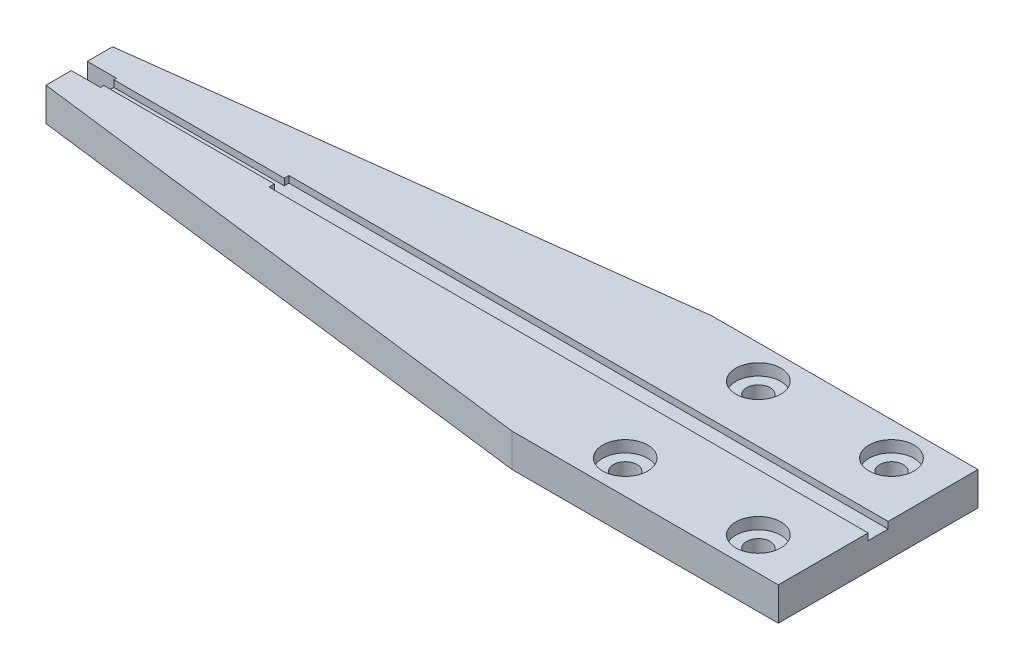
ISO-10303-21;
HEADER;
FILE_DESCRIPTION(('STEP AP214'),'2;1');
FILE_NAME('part.step','',(''),(''),'','','');
FILE_SCHEMA(('AUTOMOTIVE_DESIGN { 1 0 10303 214 1 1 1 1 }'));
ENDSEC;
DATA;
#1=APPLICATION_CONTEXT('core data for automotive mechanical design processes');
#2=APPLICATION_PROTOCOL_DEFINITION('international standard','automotive_design',2000,#1);
#3=PRODUCT_CONTEXT('',#1,'mechanical');
#4=PRODUCT('Part','Part','',(#3));
#5=PRODUCT_RELATED_PRODUCT_CATEGORY('part','',(#4));
#6=PRODUCT_DEFINITION_FORMATION('','',#4);
#7=PRODUCT_DEFINITION_CONTEXT('part definition',#1,'design');
#8=PRODUCT_DEFINITION('design','',#6,#7);
#9=PRODUCT_DEFINITION_SHAPE('','',#8);
#10=(LENGTH_UNIT() NAMED_UNIT(*) SI_UNIT(.MILLI.,.METRE.));
#11=(NAMED_UNIT(*) PLANE_ANGLE_UNIT() SI_UNIT($,.RADIAN.));
#12=(NAMED_UNIT(*) SI_UNIT($,.STERADIAN.) SOLID_ANGLE_UNIT());
#13=UNCERTAINTY_MEASURE_WITH_UNIT(LENGTH_MEASURE(1.E-05),#10,'distance_accuracy_value','');
#14=(GEOMETRIC_REPRESENTATION_CONTEXT(3) GLOBAL_UNCERTAINTY_ASSIGNED_CONTEXT((#13)) GLOBAL_UNIT_ASSIGNED_CONTEXT((#10,
#11,#12)) REPRESENTATION_CONTEXT('',''));
#15=CARTESIAN_POINT('',(0.,0.,0.));
#16=DIRECTION('',(0.,0.,1.));
#17=DIRECTION('',(1.,0.,0.));
#18=AXIS2_PLACEMENT_3D('',#15,#16,#17);
#19=CARTESIAN_POINT('',(152.4,3.175,19.05));
#20=DIRECTION('',(0.,-1.,0.));
#21=DIRECTION('',(0.,0.,-1.));
#22=AXIS2_PLACEMENT_3D('',#19,#20,#21);
#23=PLANE('',#22);
#24=CARTESIAN_POINT('',(116.847626006516,3.175,-12.7));
#25=DIRECTION('',(0.,1.,0.));
#26=DIRECTION('',(0.,0.,1.));
#27=AXIS2_PLACEMENT_3D('',#24,#25,#26);
#28=CIRCLE('',#27,4.3);
#29=CARTESIAN_POINT('',(116.847626006516,3.175,-8.4));
#30=VERTEX_POINT('',#29);
#31=EDGE_CURVE('E338',#30,#30,#28,.T.);
#32=ORIENTED_EDGE('',*,*,#31,.F.);
#33=EDGE_LOOP('',(#32));
#34=FACE_BOUND('',#33,.T.);
#35=CARTESIAN_POINT('',(142.247626006516,3.175,-12.7));
#36=DIRECTION('',(0.,1.,0.));
#37=DIRECTION('',(0.,0.,1.));
#38=AXIS2_PLACEMENT_3D('',#35,#36,#37);
#39=CIRCLE('',#38,4.3);
#40=CARTESIAN_POINT('',(142.247626006516,3.175,-8.4));
#41=VERTEX_POINT('',#40);
#42=EDGE_CURVE('E322',#41,#41,#39,.T.);
#43=ORIENTED_EDGE('',*,*,#42,.F.);
#44=EDGE_LOOP('',(#43));
#45=FACE_BOUND('',#44,.T.);
#46=DIRECTION('',(-1.,0.,0.));
#47=VECTOR('',#46,1.);
#48=CARTESIAN_POINT('',(152.4,3.175,-19.05));
#49=LINE('',#48,#47);
#50=CARTESIAN_POINT('',(152.4,3.175,-19.05));
#51=VERTEX_POINT('',#50);
#52=CARTESIAN_POINT('',(101.6,3.175,-19.05));
#53=VERTEX_POINT('',#52);
#54=EDGE_CURVE('E218',#51,#53,#49,.T.);
#55=ORIENTED_EDGE('',*,*,#54,.T.);
#56=DIRECTION('',(0.992277876713668,0.,-0.124034734589209));
#57=VECTOR('',#56,1.);
#58=CARTESIAN_POINT('',(0.,3.175,-6.35));
#59=LINE('',#58,#57);
#60=CARTESIAN_POINT('',(0.,3.175,-6.35));
#61=VERTEX_POINT('',#60);
#62=EDGE_CURVE('E421',#61,#53,#59,.T.);
#63=ORIENTED_EDGE('',*,*,#62,.F.);
#64=DIRECTION('',(0.,0.,1.));
#65=VECTOR('',#64,1.);
#66=CARTESIAN_POINT('',(0.,3.175,19.05));
#67=LINE('',#66,#65);
#68=CARTESIAN_POINT('',(0.,3.175,-1.52399999999999));
#69=VERTEX_POINT('',#68);
#70=EDGE_CURVE('E199',#61,#69,#67,.T.);
#71=ORIENTED_EDGE('',*,*,#70,.T.);
#72=DIRECTION('',(-1.,0.,0.));
#73=VECTOR('',#72,1.);
#74=CARTESIAN_POINT('',(5.588,3.175,-1.524));
#75=LINE('',#74,#73);
#76=CARTESIAN_POINT('',(5.588,3.175,-1.524));
#77=VERTEX_POINT('',#76);
#78=EDGE_CURVE('E282',#77,#69,#75,.T.);
#79=ORIENTED_EDGE('',*,*,#78,.F.);
#80=DIRECTION('',(0.,0.,-1.));
#81=VECTOR('',#80,1.);
#82=CARTESIAN_POINT('',(5.588,3.175,1.524));
#83=LINE('',#82,#81);
#84=CARTESIAN_POINT('',(5.588,3.175,-1.016));
#85=VERTEX_POINT('',#84);
#86=EDGE_CURVE('E270',#85,#77,#83,.T.);
#87=ORIENTED_EDGE('',*,*,#86,.F.);
#88=DIRECTION('',(-1.,0.,0.));
#89=VECTOR('',#88,1.);
#90=CARTESIAN_POINT('',(5.588,3.175,-1.016));
#91=LINE('',#90,#89);
#92=CARTESIAN_POINT('',(38.1,3.175,-1.016));
#93=VERTEX_POINT('',#92);
#94=EDGE_CURVE('E441',#93,#85,#91,.T.);
#95=ORIENTED_EDGE('',*,*,#94,.F.);
#96=DIRECTION('',(0.,0.,1.));
#97=VECTOR('',#96,1.);
#98=CARTESIAN_POINT('',(38.1,3.175,1.90500000000054));
#99=LINE('',#98,#97);
#100=CARTESIAN_POINT('',(38.1,3.175,-1.90499999999946));
#101=VERTEX_POINT('',#100);
#102=EDGE_CURVE('E238',#101,#93,#99,.T.);
#103=ORIENTED_EDGE('',*,*,#102,.F.);
#104=DIRECTION('',(-1.,0.,0.));
#105=VECTOR('',#104,1.);
#106=CARTESIAN_POINT('',(38.1,3.175,-1.90499999999946));
#107=LINE('',#106,#105);
#108=CARTESIAN_POINT('',(152.4,3.175,-1.905));
#109=VERTEX_POINT('',#108);
#110=EDGE_CURVE('E235',#109,#101,#107,.T.);
#111=ORIENTED_EDGE('',*,*,#110,.F.);
#112=DIRECTION('',(0.,0.,1.));
#113=VECTOR('',#112,1.);
#114=CARTESIAN_POINT('',(152.4,3.175,19.05));
#115=LINE('',#114,#113);
#116=EDGE_CURVE('E210',#51,#109,#115,.T.);
#117=ORIENTED_EDGE('',*,*,#116,.F.);
#118=EDGE_LOOP('',(#55,#63,#71,#79,#87,#95,#103,#111,#117));
#119=FACE_BOUND('',#118,.T.);
#120=ADVANCED_FACE('F42',(#34,#45,#119),#23,.F.);
#121=CARTESIAN_POINT('',(38.1,1.905,1.90500000000054));
#122=DIRECTION('',(-1.,0.,0.));
#123=DIRECTION('',(0.,0.,1.));
#124=AXIS2_PLACEMENT_3D('',#121,#122,#123);
#125=PLANE('',#124);
#126=ORIENTED_EDGE('',*,*,#102,.T.);
#127=DIRECTION('',(0.,1.,0.));
#128=VECTOR('',#127,1.);
#129=CARTESIAN_POINT('',(38.1,1.905,-1.016));
#130=LINE('',#129,#128);
#131=CARTESIAN_POINT('',(38.1,1.905,-1.016));
#132=VERTEX_POINT('',#131);
#133=EDGE_CURVE('E458',#132,#93,#130,.T.);
#134=ORIENTED_EDGE('',*,*,#133,.F.);
#135=DIRECTION('',(0.,0.,1.));
#136=VECTOR('',#135,1.);
#137=CARTESIAN_POINT('',(38.1,1.905,1.90500000000054));
#138=LINE('',#137,#136);
#139=CARTESIAN_POINT('',(38.1,1.905,-1.90499999999946));
#140=VERTEX_POINT('',#139);
#141=EDGE_CURVE('E246',#140,#132,#138,.T.);
#142=ORIENTED_EDGE('',*,*,#141,.F.);
#143=DIRECTION('',(0.,1.,0.));
#144=VECTOR('',#143,1.);
#145=CARTESIAN_POINT('',(38.1,1.905,-1.90499999999946));
#146=LINE('',#145,#144);
#147=EDGE_CURVE('E251',#140,#101,#146,.T.);
#148=ORIENTED_EDGE('',*,*,#147,.T.);
#149=EDGE_LOOP('',(#126,#134,#142,#148));
#150=FACE_BOUND('',#149,.T.);
#151=ADVANCED_FACE('F388',(#150),#125,.F.);
#152=CARTESIAN_POINT('',(152.4,3.175,19.05));
#153=DIRECTION('',(0.,0.,-1.));
#154=DIRECTION('',(-1.,0.,0.));
#155=AXIS2_PLACEMENT_3D('',#152,#153,#154);
#156=PLANE('',#155);
#157=DIRECTION('',(-1.,0.,0.));
#158=VECTOR('',#157,1.);
#159=CARTESIAN_POINT('',(152.4,3.175,19.05));
#160=LINE('',#159,#158);
#161=CARTESIAN_POINT('',(152.4,3.175,19.05));
#162=VERTEX_POINT('',#161);
#163=CARTESIAN_POINT('',(101.6,3.175,19.05));
#164=VERTEX_POINT('',#163);
#165=EDGE_CURVE('E179',#162,#164,#160,.T.);
#166=ORIENTED_EDGE('',*,*,#165,.T.);
#167=DIRECTION('',(0.,1.,0.));
#168=VECTOR('',#167,1.);
#169=CARTESIAN_POINT('',(101.6,-3.175,19.05));
#170=LINE('',#169,#168);
#171=CARTESIAN_POINT('',(101.6,-3.175,19.05));
#172=VERTEX_POINT('',#171);
#173=EDGE_CURVE('E170',#172,#164,#170,.T.);
#174=ORIENTED_EDGE('',*,*,#173,.F.);
#175=DIRECTION('',(-1.,0.,0.));
#176=VECTOR('',#175,1.);
#177=CARTESIAN_POINT('',(152.4,-3.175,19.05));
#178=LINE('',#177,#176);
#179=CARTESIAN_POINT('',(152.4,-3.175,19.05));
#180=VERTEX_POINT('',#179);
#181=EDGE_CURVE('E11',#180,#172,#178,.T.);
#182=ORIENTED_EDGE('',*,*,#181,.F.);
#183=DIRECTION('',(0.,-1.,0.));
#184=VECTOR('',#183,1.);
#185=CARTESIAN_POINT('',(152.4,3.175,19.05));
#186=LINE('',#185,#184);
#187=EDGE_CURVE('E191',#162,#180,#186,.T.);
#188=ORIENTED_EDGE('',*,*,#187,.F.);
#189=EDGE_LOOP('',(#166,#174,#182,#188));
#190=FACE_BOUND('',#189,.T.);
#191=ADVANCED_FACE('F44',(#190),#156,.F.);
#192=CARTESIAN_POINT('',(152.4,-3.175,19.05));
#193=DIRECTION('',(0.,1.,0.));
#194=DIRECTION('',(0.,0.,1.));
#195=AXIS2_PLACEMENT_3D('',#192,#193,#194);
#196=PLANE('',#195);
#197=CARTESIAN_POINT('',(142.247626006516,-3.175,12.7));
#198=DIRECTION('',(0.,1.,0.));
#199=DIRECTION('',(0.,0.,1.));
#200=AXIS2_PLACEMENT_3D('',#197,#198,#199);
#201=CIRCLE('',#200,2.25);
#202=CARTESIAN_POINT('',(142.247626006516,-3.175,14.95));
#203=VERTEX_POINT('',#202);
#204=EDGE_CURVE('E318',#203,#203,#201,.T.);
#205=ORIENTED_EDGE('',*,*,#204,.T.);
#206=EDGE_LOOP('',(#205));
#207=FACE_BOUND('',#206,.T.);
#208=CARTESIAN_POINT('',(142.247626006516,-3.175,-12.7));
#209=DIRECTION('',(0.,1.,0.));
#210=DIRECTION('',(0.,0.,1.));
#211=AXIS2_PLACEMENT_3D('',#208,#209,#210);
#212=CIRCLE('',#211,2.25);
#213=CARTESIAN_POINT('',(142.247626006516,-3.175,-10.45));
#214=VERTEX_POINT('',#213);
#215=EDGE_CURVE('E334',#214,#214,#212,.T.);
#216=ORIENTED_EDGE('',*,*,#215,.T.);
#217=EDGE_LOOP('',(#216));
#218=FACE_BOUND('',#217,.T.);
#219=CARTESIAN_POINT('',(116.847626006516,-3.175,-12.7));
#220=DIRECTION('',(0.,1.,0.));
#221=DIRECTION('',(0.,0.,1.));
#222=AXIS2_PLACEMENT_3D('',#219,#220,#221);
#223=CIRCLE('',#222,2.25);
#224=CARTESIAN_POINT('',(116.847626006516,-3.175,-10.45));
#225=VERTEX_POINT('',#224);
#226=EDGE_CURVE('E350',#225,#225,#223,.T.);
#227=ORIENTED_EDGE('',*,*,#226,.T.);
#228=EDGE_LOOP('',(#227));
#229=FACE_BOUND('',#228,.T.);
#230=CARTESIAN_POINT('',(116.847626006516,-3.175,12.7));
#231=DIRECTION('',(0.,1.,0.));
#232=DIRECTION('',(0.,0.,1.));
#233=AXIS2_PLACEMENT_3D('',#230,#231,#232);
#234=CIRCLE('',#233,2.25);
#235=CARTESIAN_POINT('',(116.847626006516,-3.175,14.95));
#236=VERTEX_POINT('',#235);
#237=EDGE_CURVE('E205',#236,#236,#234,.T.);
#238=ORIENTED_EDGE('',*,*,#237,.T.);
#239=EDGE_LOOP('',(#238));
#240=FACE_BOUND('',#239,.T.);
#241=ORIENTED_EDGE('',*,*,#181,.T.);
#242=DIRECTION('',(-0.992277876713668,0.,-0.124034734589208));
#243=VECTOR('',#242,1.);
#244=CARTESIAN_POINT('',(0.,-3.175,6.35));
#245=LINE('',#244,#243);
#246=CARTESIAN_POINT('',(0.,-3.175,6.35));
#247=VERTEX_POINT('',#246);
#248=EDGE_CURVE('E167',#172,#247,#245,.T.);
#249=ORIENTED_EDGE('',*,*,#248,.T.);
#250=DIRECTION('',(0.,0.,-1.));
#251=VECTOR('',#250,1.);
#252=CARTESIAN_POINT('',(0.,-3.175,19.05));
#253=LINE('',#252,#251);
#254=CARTESIAN_POINT('',(0.,-3.175,-6.34999999999999));
#255=VERTEX_POINT('',#254);
#256=EDGE_CURVE('E66',#247,#255,#253,.T.);
#257=ORIENTED_EDGE('',*,*,#256,.T.);
#258=DIRECTION('',(0.992277876713668,0.,-0.124034734589209));
#259=VECTOR('',#258,1.);
#260=CARTESIAN_POINT('',(0.,-3.175,-6.35));
#261=LINE('',#260,#259);
#262=CARTESIAN_POINT('',(101.6,-3.175,-19.05));
#263=VERTEX_POINT('',#262);
#264=EDGE_CURVE('E424',#255,#263,#261,.T.);
#265=ORIENTED_EDGE('',*,*,#264,.T.);
#266=DIRECTION('',(-1.,0.,0.));
#267=VECTOR('',#266,1.);
#268=CARTESIAN_POINT('',(152.4,-3.175,-19.05));
#269=LINE('',#268,#267);
#270=CARTESIAN_POINT('',(152.4,-3.175,-19.05));
#271=VERTEX_POINT('',#270);
#272=EDGE_CURVE('E51',#271,#263,#269,.T.);
#273=ORIENTED_EDGE('',*,*,#272,.F.);
#274=DIRECTION('',(0.,0.,-1.));
#275=VECTOR('',#274,1.);
#276=CARTESIAN_POINT('',(152.4,-3.175,19.05));
#277=LINE('',#276,#275);
#278=EDGE_CURVE('E184',#180,#271,#277,.T.);
#279=ORIENTED_EDGE('',*,*,#278,.F.);
#280=EDGE_LOOP('',(#241,#249,#257,#265,#273,#279));
#281=FACE_BOUND('',#280,.T.);
#282=ADVANCED_FACE('F182',(#207,#218,#229,#240,#281),#196,.F.);
#283=CARTESIAN_POINT('',(152.4,3.175,-19.05));
#284=DIRECTION('',(0.,0.,1.));
#285=DIRECTION('',(1.,0.,0.));
#286=AXIS2_PLACEMENT_3D('',#283,#284,#285);
#287=PLANE('',#286);
#288=ORIENTED_EDGE('',*,*,#272,.T.);
#289=DIRECTION('',(0.,1.,0.));
#290=VECTOR('',#289,1.);
#291=CARTESIAN_POINT('',(101.6,-3.175,-19.05));
#292=LINE('',#291,#290);
#293=EDGE_CURVE('E226',#263,#53,#292,.T.);
#294=ORIENTED_EDGE('',*,*,#293,.T.);
#295=ORIENTED_EDGE('',*,*,#54,.F.);
#296=DIRECTION('',(0.,1.,0.));
#297=VECTOR('',#296,1.);
#298=CARTESIAN_POINT('',(152.4,3.175,-19.05));
#299=LINE('',#298,#297);
#300=EDGE_CURVE('E190',#271,#51,#299,.T.);
#301=ORIENTED_EDGE('',*,*,#300,.F.);
#302=EDGE_LOOP('',(#288,#294,#295,#301));
#303=FACE_BOUND('',#302,.T.);
#304=ADVANCED_FACE('F224',(#303),#287,.F.);
#305=CARTESIAN_POINT('',(142.247626006516,3.175,12.7));
#306=DIRECTION('',(0.,1.,0.));
#307=DIRECTION('',(0.,0.,1.));
#308=AXIS2_PLACEMENT_3D('',#305,#306,#307);
#309=CIRCLE('',#308,4.3);
#310=CARTESIAN_POINT('',(142.247626006516,3.175,17.));
#311=VERTEX_POINT('',#310);
#312=EDGE_CURVE('E297',#311,#311,#309,.T.);
#313=ORIENTED_EDGE('',*,*,#312,.F.);
#314=EDGE_LOOP('',(#313));
#315=FACE_BOUND('',#314,.T.);
#316=CARTESIAN_POINT('',(116.847626006516,3.175,12.7));
#317=DIRECTION('',(0.,1.,0.));
#318=DIRECTION('',(0.,0.,1.));
#319=AXIS2_PLACEMENT_3D('',#316,#317,#318);
#320=CIRCLE('',#319,4.3);
#321=CARTESIAN_POINT('',(116.847626006516,3.175,17.));
#322=VERTEX_POINT('',#321);
#323=EDGE_CURVE('E354',#322,#322,#320,.T.);
#324=ORIENTED_EDGE('',*,*,#323,.F.);
#325=EDGE_LOOP('',(#324));
#326=FACE_BOUND('',#325,.T.);
#327=CARTESIAN_POINT('',(0.,3.175,1.524));
#328=VERTEX_POINT('',#327);
#329=CARTESIAN_POINT('',(0.,3.175,6.35));
#330=VERTEX_POINT('',#329);
#331=EDGE_CURVE('E202',#328,#330,#67,.T.);
#332=ORIENTED_EDGE('',*,*,#331,.T.);
#333=DIRECTION('',(-0.992277876713668,0.,-0.124034734589208));
#334=VECTOR('',#333,1.);
#335=CARTESIAN_POINT('',(0.,3.175,6.35));
#336=LINE('',#335,#334);
#337=EDGE_CURVE('E58',#164,#330,#336,.T.);
#338=ORIENTED_EDGE('',*,*,#337,.F.);
#339=ORIENTED_EDGE('',*,*,#165,.F.);
#340=CARTESIAN_POINT('',(152.4,3.175,1.905));
#341=VERTEX_POINT('',#340);
#342=EDGE_CURVE('E197',#341,#162,#115,.T.);
#343=ORIENTED_EDGE('',*,*,#342,.F.);
#344=DIRECTION('',(1.,0.,0.));
#345=VECTOR('',#344,1.);
#346=CARTESIAN_POINT('',(152.4,3.175,1.905));
#347=LINE('',#346,#345);
#348=CARTESIAN_POINT('',(38.1,3.175,1.90500000000054));
#349=VERTEX_POINT('',#348);
#350=EDGE_CURVE('E242',#349,#341,#347,.T.);
#351=ORIENTED_EDGE('',*,*,#350,.F.);
#352=CARTESIAN_POINT('',(38.1,3.175,0.889));
#353=VERTEX_POINT('',#352);
#354=EDGE_CURVE('E457',#353,#349,#99,.T.);
#355=ORIENTED_EDGE('',*,*,#354,.F.);
#356=DIRECTION('',(1.,0.,0.));
#357=VECTOR('',#356,1.);
#358=CARTESIAN_POINT('',(38.1,3.175,0.889));
#359=LINE('',#358,#357);
#360=CARTESIAN_POINT('',(5.588,3.175,0.889000000000004));
#361=VERTEX_POINT('',#360);
#362=EDGE_CURVE('E433',#361,#353,#359,.T.);
#363=ORIENTED_EDGE('',*,*,#362,.F.);
#364=CARTESIAN_POINT('',(5.588,3.175,1.524));
#365=VERTEX_POINT('',#364);
#366=EDGE_CURVE('E265',#365,#361,#83,.T.);
#367=ORIENTED_EDGE('',*,*,#366,.F.);
#368=DIRECTION('',(-1.,0.,0.));
#369=VECTOR('',#368,1.);
#370=CARTESIAN_POINT('',(5.588,3.175,1.524));
#371=LINE('',#370,#369);
#372=EDGE_CURVE('E293',#365,#328,#371,.T.);
#373=ORIENTED_EDGE('',*,*,#372,.T.);
#374=EDGE_LOOP('',(#332,#338,#339,#343,#351,#355,#363,#367,#373));
#375=FACE_BOUND('',#374,.T.);
#376=ADVANCED_FACE('F391',(#315,#326,#375),#23,.F.);
#377=CARTESIAN_POINT('',(152.4,0.,0.));
#378=DIRECTION('',(1.,0.,0.));
#379=DIRECTION('',(0.,0.,-1.));
#380=AXIS2_PLACEMENT_3D('',#377,#378,#379);
#381=PLANE('',#380);
#382=DIRECTION('',(0.,1.,0.));
#383=VECTOR('',#382,1.);
#384=CARTESIAN_POINT('',(152.4,1.905,-1.905));
#385=LINE('',#384,#383);
#386=CARTESIAN_POINT('',(152.4,1.905,-1.905));
#387=VERTEX_POINT('',#386);
#388=EDGE_CURVE('E229',#387,#109,#385,.T.);
#389=ORIENTED_EDGE('',*,*,#388,.F.);
#390=DIRECTION('',(0.,0.,-1.));
#391=VECTOR('',#390,1.);
#392=CARTESIAN_POINT('',(152.4,1.905,-1.905));
#393=LINE('',#392,#391);
#394=CARTESIAN_POINT('',(152.4,1.905,1.90500000000054));
#395=VERTEX_POINT('',#394);
#396=EDGE_CURVE('E472',#395,#387,#393,.T.);
#397=ORIENTED_EDGE('',*,*,#396,.F.);
#398=DIRECTION('',(0.,1.,0.));
#399=VECTOR('',#398,1.);
#400=CARTESIAN_POINT('',(152.4,1.905,1.905));
#401=LINE('',#400,#399);
#402=EDGE_CURVE('E257',#395,#341,#401,.T.);
#403=ORIENTED_EDGE('',*,*,#402,.T.);
#404=ORIENTED_EDGE('',*,*,#342,.T.);
#405=ORIENTED_EDGE('',*,*,#187,.T.);
#406=ORIENTED_EDGE('',*,*,#278,.T.);
#407=ORIENTED_EDGE('',*,*,#300,.T.);
#408=ORIENTED_EDGE('',*,*,#116,.T.);
#409=EDGE_LOOP('',(#389,#397,#403,#404,#405,#406,#407,#408));
#410=FACE_BOUND('',#409,.T.);
#411=ADVANCED_FACE('F194',(#410),#381,.T.);
#412=CARTESIAN_POINT('',(0.,0.,0.));
#413=DIRECTION('',(1.,0.,0.));
#414=DIRECTION('',(0.,0.,-1.));
#415=AXIS2_PLACEMENT_3D('',#412,#413,#414);
#416=PLANE('',#415);
#417=ORIENTED_EDGE('',*,*,#256,.F.);
#418=DIRECTION('',(0.,1.,0.));
#419=VECTOR('',#418,1.);
#420=CARTESIAN_POINT('',(0.,-3.175,6.35));
#421=LINE('',#420,#419);
#422=EDGE_CURVE('E171',#247,#330,#421,.T.);
#423=ORIENTED_EDGE('',*,*,#422,.T.);
#424=ORIENTED_EDGE('',*,*,#331,.F.);
#425=DIRECTION('',(0.,1.,0.));
#426=VECTOR('',#425,1.);
#427=CARTESIAN_POINT('',(0.,0.127,1.524));
#428=LINE('',#427,#426);
#429=CARTESIAN_POINT('',(0.,0.127,1.524));
#430=VERTEX_POINT('',#429);
#431=EDGE_CURVE('E290',#430,#328,#428,.T.);
#432=ORIENTED_EDGE('',*,*,#431,.F.);
#433=DIRECTION('',(0.,0.,1.));
#434=VECTOR('',#433,1.);
#435=CARTESIAN_POINT('',(0.,0.127,-1.524));
#436=LINE('',#435,#434);
#437=CARTESIAN_POINT('',(0.,0.127,-1.524));
#438=VERTEX_POINT('',#437);
#439=EDGE_CURVE('E286',#438,#430,#436,.T.);
#440=ORIENTED_EDGE('',*,*,#439,.F.);
#441=DIRECTION('',(0.,-1.,0.));
#442=VECTOR('',#441,1.);
#443=CARTESIAN_POINT('',(0.,3.175,-1.524));
#444=LINE('',#443,#442);
#445=EDGE_CURVE('E254',#69,#438,#444,.T.);
#446=ORIENTED_EDGE('',*,*,#445,.F.);
#447=ORIENTED_EDGE('',*,*,#70,.F.);
#448=DIRECTION('',(0.,1.,0.));
#449=VECTOR('',#448,1.);
#450=CARTESIAN_POINT('',(0.,-3.175,-6.35));
#451=LINE('',#450,#449);
#452=EDGE_CURVE('E430',#255,#61,#451,.T.);
#453=ORIENTED_EDGE('',*,*,#452,.F.);
#454=EDGE_LOOP('',(#417,#423,#424,#432,#440,#446,#447,#453));
#455=FACE_BOUND('',#454,.T.);
#456=ADVANCED_FACE('F374',(#455),#416,.F.);
#457=CARTESIAN_POINT('',(116.847626006516,3.175,12.7));
#458=DIRECTION('',(0.,1.,0.));
#459=DIRECTION('',(0.,0.,1.));
#460=AXIS2_PLACEMENT_3D('',#457,#458,#459);
#461=CYLINDRICAL_SURFACE('',#460,2.25);
#462=ORIENTED_EDGE('',*,*,#237,.F.);
#463=EDGE_LOOP('',(#462));
#464=FACE_BOUND('',#463,.T.);
#465=CARTESIAN_POINT('',(116.847626006516,0.975,12.7));
#466=DIRECTION('',(0.,1.,0.));
#467=DIRECTION('',(0.,0.,1.));
#468=AXIS2_PLACEMENT_3D('',#465,#466,#467);
#469=CIRCLE('',#468,2.25);
#470=CARTESIAN_POINT('',(116.847626006516,0.975,14.95));
#471=VERTEX_POINT('',#470);
#472=EDGE_CURVE('E361',#471,#471,#469,.T.);
#473=ORIENTED_EDGE('',*,*,#472,.T.);
#474=EDGE_LOOP('',(#473));
#475=FACE_BOUND('',#474,.T.);
#476=ADVANCED_FACE('F371',(#464,#475),#461,.F.);
#477=CARTESIAN_POINT('',(119.097626006516,0.975,12.7));
#478=DIRECTION('',(0.,-1.,0.));
#479=DIRECTION('',(0.,0.,-1.));
#480=AXIS2_PLACEMENT_3D('',#477,#478,#479);
#481=PLANE('',#480);
#482=ORIENTED_EDGE('',*,*,#472,.F.);
#483=EDGE_LOOP('',(#482));
#484=FACE_BOUND('',#483,.T.);
#485=CARTESIAN_POINT('',(116.847626006516,0.975,12.7));
#486=DIRECTION('',(0.,1.,0.));
#487=DIRECTION('',(0.,0.,1.));
#488=AXIS2_PLACEMENT_3D('',#485,#486,#487);
#489=CIRCLE('',#488,4.3);
#490=CARTESIAN_POINT('',(116.847626006516,0.975,17.));
#491=VERTEX_POINT('',#490);
#492=EDGE_CURVE('E358',#491,#491,#489,.T.);
#493=ORIENTED_EDGE('',*,*,#492,.T.);
#494=EDGE_LOOP('',(#493));
#495=FACE_BOUND('',#494,.T.);
#496=ADVANCED_FACE('F373',(#484,#495),#481,.F.);
#497=CARTESIAN_POINT('',(116.847626006516,3.175,12.7));
#498=DIRECTION('',(0.,1.,0.));
#499=DIRECTION('',(0.,0.,1.));
#500=AXIS2_PLACEMENT_3D('',#497,#498,#499);
#501=CYLINDRICAL_SURFACE('',#500,4.3);
#502=ORIENTED_EDGE('',*,*,#492,.F.);
#503=EDGE_LOOP('',(#502));
#504=FACE_BOUND('',#503,.T.);
#505=ORIENTED_EDGE('',*,*,#323,.T.);
#506=EDGE_LOOP('',(#505));
#507=FACE_BOUND('',#506,.T.);
#508=ADVANCED_FACE('F380',(#504,#507),#501,.F.);
#509=CARTESIAN_POINT('',(116.847626006516,3.175,-12.7));
#510=DIRECTION('',(0.,1.,0.));
#511=DIRECTION('',(0.,0.,1.));
#512=AXIS2_PLACEMENT_3D('',#509,#510,#511);
#513=CYLINDRICAL_SURFACE('',#512,2.25);
#514=ORIENTED_EDGE('',*,*,#226,.F.);
#515=EDGE_LOOP('',(#514));
#516=FACE_BOUND('',#515,.T.);
#517=CARTESIAN_POINT('',(116.847626006516,0.975,-12.7));
#518=DIRECTION('',(0.,1.,0.));
#519=DIRECTION('',(0.,0.,1.));
#520=AXIS2_PLACEMENT_3D('',#517,#518,#519);
#521=CIRCLE('',#520,2.25);
#522=CARTESIAN_POINT('',(116.847626006516,0.975,-10.45));
#523=VERTEX_POINT('',#522);
#524=EDGE_CURVE('E346',#523,#523,#521,.T.);
#525=ORIENTED_EDGE('',*,*,#524,.T.);
#526=EDGE_LOOP('',(#525));
#527=FACE_BOUND('',#526,.T.);
#528=ADVANCED_FACE('F576',(#516,#527),#513,.F.);
#529=CARTESIAN_POINT('',(119.097626006516,0.975,-12.7));
#530=DIRECTION('',(0.,-1.,0.));
#531=DIRECTION('',(0.,0.,-1.));
#532=AXIS2_PLACEMENT_3D('',#529,#530,#531);
#533=PLANE('',#532);
#534=ORIENTED_EDGE('',*,*,#524,.F.);
#535=EDGE_LOOP('',(#534));
#536=FACE_BOUND('',#535,.T.);
#537=CARTESIAN_POINT('',(116.847626006516,0.975,-12.7));
#538=DIRECTION('',(0.,1.,0.));
#539=DIRECTION('',(0.,0.,1.));
#540=AXIS2_PLACEMENT_3D('',#537,#538,#539);
#541=CIRCLE('',#540,4.3);
#542=CARTESIAN_POINT('',(116.847626006516,0.975,-8.4));
#543=VERTEX_POINT('',#542);
#544=EDGE_CURVE('E342',#543,#543,#541,.T.);
#545=ORIENTED_EDGE('',*,*,#544,.T.);
#546=EDGE_LOOP('',(#545));
#547=FACE_BOUND('',#546,.T.);
#548=ADVANCED_FACE('F572',(#536,#547),#533,.F.);
#549=CARTESIAN_POINT('',(116.847626006516,3.175,-12.7));
#550=DIRECTION('',(0.,1.,0.));
#551=DIRECTION('',(0.,0.,1.));
#552=AXIS2_PLACEMENT_3D('',#549,#550,#551);
#553=CYLINDRICAL_SURFACE('',#552,4.3);
#554=ORIENTED_EDGE('',*,*,#544,.F.);
#555=EDGE_LOOP('',(#554));
#556=FACE_BOUND('',#555,.T.);
#557=ORIENTED_EDGE('',*,*,#31,.T.);
#558=EDGE_LOOP('',(#557));
#559=FACE_BOUND('',#558,.T.);
#560=ADVANCED_FACE('F568',(#556,#559),#553,.F.);
#561=CARTESIAN_POINT('',(142.247626006516,3.175,-12.7));
#562=DIRECTION('',(0.,1.,0.));
#563=DIRECTION('',(0.,0.,1.));
#564=AXIS2_PLACEMENT_3D('',#561,#562,#563);
#565=CYLINDRICAL_SURFACE('',#564,2.25);
#566=ORIENTED_EDGE('',*,*,#215,.F.);
#567=EDGE_LOOP('',(#566));
#568=FACE_BOUND('',#567,.T.);
#569=CARTESIAN_POINT('',(142.247626006516,0.975,-12.7));
#570=DIRECTION('',(0.,1.,0.));
#571=DIRECTION('',(0.,0.,1.));
#572=AXIS2_PLACEMENT_3D('',#569,#570,#571);
#573=CIRCLE('',#572,2.25);
#574=CARTESIAN_POINT('',(142.247626006516,0.975,-10.45));
#575=VERTEX_POINT('',#574);
#576=EDGE_CURVE('E330',#575,#575,#573,.T.);
#577=ORIENTED_EDGE('',*,*,#576,.T.);
#578=EDGE_LOOP('',(#577));
#579=FACE_BOUND('',#578,.T.);
#580=ADVANCED_FACE('F564',(#568,#579),#565,.F.);
#581=CARTESIAN_POINT('',(144.497626006516,0.975,-12.7));
#582=DIRECTION('',(0.,-1.,0.));
#583=DIRECTION('',(0.,0.,-1.));
#584=AXIS2_PLACEMENT_3D('',#581,#582,#583);
#585=PLANE('',#584);
#586=ORIENTED_EDGE('',*,*,#576,.F.);
#587=EDGE_LOOP('',(#586));
#588=FACE_BOUND('',#587,.T.);
#589=CARTESIAN_POINT('',(142.247626006516,0.975,-12.7));
#590=DIRECTION('',(0.,1.,0.));
#591=DIRECTION('',(0.,0.,1.));
#592=AXIS2_PLACEMENT_3D('',#589,#590,#591);
#593=CIRCLE('',#592,4.3);
#594=CARTESIAN_POINT('',(142.247626006516,0.975,-8.4));
#595=VERTEX_POINT('',#594);
#596=EDGE_CURVE('E326',#595,#595,#593,.T.);
#597=ORIENTED_EDGE('',*,*,#596,.T.);
#598=EDGE_LOOP('',(#597));
#599=FACE_BOUND('',#598,.T.);
#600=ADVANCED_FACE('F560',(#588,#599),#585,.F.);
#601=CARTESIAN_POINT('',(142.247626006516,3.175,-12.7));
#602=DIRECTION('',(0.,1.,0.));
#603=DIRECTION('',(0.,0.,1.));
#604=AXIS2_PLACEMENT_3D('',#601,#602,#603);
#605=CYLINDRICAL_SURFACE('',#604,4.3);
#606=ORIENTED_EDGE('',*,*,#596,.F.);
#607=EDGE_LOOP('',(#606));
#608=FACE_BOUND('',#607,.T.);
#609=ORIENTED_EDGE('',*,*,#42,.T.);
#610=EDGE_LOOP('',(#609));
#611=FACE_BOUND('',#610,.T.);
#612=ADVANCED_FACE('F556',(#608,#611),#605,.F.);
#613=CARTESIAN_POINT('',(142.247626006516,3.175,12.7));
#614=DIRECTION('',(0.,1.,0.));
#615=DIRECTION('',(0.,0.,1.));
#616=AXIS2_PLACEMENT_3D('',#613,#614,#615);
#617=CYLINDRICAL_SURFACE('',#616,2.25);
#618=ORIENTED_EDGE('',*,*,#204,.F.);
#619=EDGE_LOOP('',(#618));
#620=FACE_BOUND('',#619,.T.);
#621=CARTESIAN_POINT('',(142.247626006516,0.975,12.7));
#622=DIRECTION('',(0.,1.,0.));
#623=DIRECTION('',(0.,0.,1.));
#624=AXIS2_PLACEMENT_3D('',#621,#622,#623);
#625=CIRCLE('',#624,2.25);
#626=CARTESIAN_POINT('',(142.247626006516,0.975,14.95));
#627=VERTEX_POINT('',#626);
#628=EDGE_CURVE('E314',#627,#627,#625,.T.);
#629=ORIENTED_EDGE('',*,*,#628,.T.);
#630=EDGE_LOOP('',(#629));
#631=FACE_BOUND('',#630,.T.);
#632=ADVANCED_FACE('F552',(#620,#631),#617,.F.);
#633=CARTESIAN_POINT('',(144.497626006516,0.975,12.7));
#634=DIRECTION('',(0.,-1.,0.));
#635=DIRECTION('',(0.,0.,-1.));
#636=AXIS2_PLACEMENT_3D('',#633,#634,#635);
#637=PLANE('',#636);
#638=ORIENTED_EDGE('',*,*,#628,.F.);
#639=EDGE_LOOP('',(#638));
#640=FACE_BOUND('',#639,.T.);
#641=CARTESIAN_POINT('',(142.247626006516,0.975,12.7));
#642=DIRECTION('',(0.,1.,0.));
#643=DIRECTION('',(0.,0.,1.));
#644=AXIS2_PLACEMENT_3D('',#641,#642,#643);
#645=CIRCLE('',#644,4.3);
#646=CARTESIAN_POINT('',(142.247626006516,0.975,17.));
#647=VERTEX_POINT('',#646);
#648=EDGE_CURVE('E310',#647,#647,#645,.T.);
#649=ORIENTED_EDGE('',*,*,#648,.T.);
#650=EDGE_LOOP('',(#649));
#651=FACE_BOUND('',#650,.T.);
#652=ADVANCED_FACE('F548',(#640,#651),#637,.F.);
#653=CARTESIAN_POINT('',(142.247626006516,3.175,12.7));
#654=DIRECTION('',(0.,1.,0.));
#655=DIRECTION('',(0.,0.,1.));
#656=AXIS2_PLACEMENT_3D('',#653,#654,#655);
#657=CYLINDRICAL_SURFACE('',#656,4.3);
#658=ORIENTED_EDGE('',*,*,#648,.F.);
#659=EDGE_LOOP('',(#658));
#660=FACE_BOUND('',#659,.T.);
#661=ORIENTED_EDGE('',*,*,#312,.T.);
#662=EDGE_LOOP('',(#661));
#663=FACE_BOUND('',#662,.T.);
#664=ADVANCED_FACE('F541',(#660,#663),#657,.F.);
#665=CARTESIAN_POINT('',(5.588,0.127,1.524));
#666=DIRECTION('',(0.,0.,1.));
#667=DIRECTION('',(0.,-1.,0.));
#668=AXIS2_PLACEMENT_3D('',#665,#666,#667);
#669=PLANE('',#668);
#670=ORIENTED_EDGE('',*,*,#431,.T.);
#671=ORIENTED_EDGE('',*,*,#372,.F.);
#672=DIRECTION('',(0.,1.,0.));
#673=VECTOR('',#672,1.);
#674=CARTESIAN_POINT('',(5.588,0.127,1.524));
#675=LINE('',#674,#673);
#676=CARTESIAN_POINT('',(5.588,0.127,1.524));
#677=VERTEX_POINT('',#676);
#678=EDGE_CURVE('E278',#677,#365,#675,.T.);
#679=ORIENTED_EDGE('',*,*,#678,.F.);
#680=DIRECTION('',(-1.,0.,0.));
#681=VECTOR('',#680,1.);
#682=CARTESIAN_POINT('',(5.588,0.127,1.524));
#683=LINE('',#682,#681);
#684=EDGE_CURVE('E298',#677,#430,#683,.T.);
#685=ORIENTED_EDGE('',*,*,#684,.T.);
#686=EDGE_LOOP('',(#670,#671,#679,#685));
#687=FACE_BOUND('',#686,.T.);
#688=ADVANCED_FACE('F504',(#687),#669,.F.);
#689=CARTESIAN_POINT('',(5.588,0.127,-1.524));
#690=DIRECTION('',(0.,-1.,0.));
#691=DIRECTION('',(0.,0.,-1.));
#692=AXIS2_PLACEMENT_3D('',#689,#690,#691);
#693=PLANE('',#692);
#694=ORIENTED_EDGE('',*,*,#439,.T.);
#695=ORIENTED_EDGE('',*,*,#684,.F.);
#696=DIRECTION('',(0.,0.,1.));
#697=VECTOR('',#696,1.);
#698=CARTESIAN_POINT('',(5.588,0.127,-1.524));
#699=LINE('',#698,#697);
#700=CARTESIAN_POINT('',(5.588,0.127,-1.524));
#701=VERTEX_POINT('',#700);
#702=EDGE_CURVE('E274',#701,#677,#699,.T.);
#703=ORIENTED_EDGE('',*,*,#702,.F.);
#704=DIRECTION('',(-1.,0.,0.));
#705=VECTOR('',#704,1.);
#706=CARTESIAN_POINT('',(5.588,0.127,-1.524));
#707=LINE('',#706,#705);
#708=EDGE_CURVE('E301',#701,#438,#707,.T.);
#709=ORIENTED_EDGE('',*,*,#708,.T.);
#710=EDGE_LOOP('',(#694,#695,#703,#709));
#711=FACE_BOUND('',#710,.T.);
#712=ADVANCED_FACE('F506',(#711),#693,.F.);
#713=CARTESIAN_POINT('',(5.588,3.175,-1.524));
#714=DIRECTION('',(0.,0.,-1.));
#715=DIRECTION('',(0.,1.,0.));
#716=AXIS2_PLACEMENT_3D('',#713,#714,#715);
#717=PLANE('',#716);
#718=ORIENTED_EDGE('',*,*,#445,.T.);
#719=ORIENTED_EDGE('',*,*,#708,.F.);
#720=DIRECTION('',(0.,-1.,0.));
#721=VECTOR('',#720,1.);
#722=CARTESIAN_POINT('',(5.588,3.175,-1.524));
#723=LINE('',#722,#721);
#724=EDGE_CURVE('E269',#77,#701,#723,.T.);
#725=ORIENTED_EDGE('',*,*,#724,.F.);
#726=ORIENTED_EDGE('',*,*,#78,.T.);
#727=EDGE_LOOP('',(#718,#719,#725,#726));
#728=FACE_BOUND('',#727,.T.);
#729=ADVANCED_FACE('F510',(#728),#717,.F.);
#730=CARTESIAN_POINT('',(5.588,0.,0.));
#731=DIRECTION('',(-1.,0.,0.));
#732=DIRECTION('',(0.,0.,1.));
#733=AXIS2_PLACEMENT_3D('',#730,#731,#732);
#734=PLANE('',#733);
#735=DIRECTION('',(0.,1.,0.));
#736=VECTOR('',#735,1.);
#737=CARTESIAN_POINT('',(5.588,1.905,-1.016));
#738=LINE('',#737,#736);
#739=CARTESIAN_POINT('',(5.588,1.905,-1.016));
#740=VERTEX_POINT('',#739);
#741=EDGE_CURVE('E453',#740,#85,#738,.T.);
#742=ORIENTED_EDGE('',*,*,#741,.T.);
#743=ORIENTED_EDGE('',*,*,#86,.T.);
#744=ORIENTED_EDGE('',*,*,#724,.T.);
#745=ORIENTED_EDGE('',*,*,#702,.T.);
#746=ORIENTED_EDGE('',*,*,#678,.T.);
#747=ORIENTED_EDGE('',*,*,#366,.T.);
#748=DIRECTION('',(0.,1.,0.));
#749=VECTOR('',#748,1.);
#750=CARTESIAN_POINT('',(5.588,1.905,0.889000000000004));
#751=LINE('',#750,#749);
#752=CARTESIAN_POINT('',(5.588,1.905,0.889000000000004));
#753=VERTEX_POINT('',#752);
#754=EDGE_CURVE('E448',#753,#361,#751,.T.);
#755=ORIENTED_EDGE('',*,*,#754,.F.);
#756=DIRECTION('',(0.,0.,1.));
#757=VECTOR('',#756,1.);
#758=CARTESIAN_POINT('',(5.588,1.905,0.889000000000004));
#759=LINE('',#758,#757);
#760=EDGE_CURVE('E436',#740,#753,#759,.T.);
#761=ORIENTED_EDGE('',*,*,#760,.F.);
#762=EDGE_LOOP('',(#742,#743,#744,#745,#746,#747,#755,#761));
#763=FACE_BOUND('',#762,.T.);
#764=ADVANCED_FACE('F500',(#763),#734,.T.);
#765=CARTESIAN_POINT('',(38.1,1.905,0.889));
#766=VERTEX_POINT('',#765);
#767=CARTESIAN_POINT('',(38.1,1.905,1.90500000000054));
#768=VERTEX_POINT('',#767);
#769=EDGE_CURVE('E241',#766,#768,#138,.T.);
#770=ORIENTED_EDGE('',*,*,#769,.F.);
#771=DIRECTION('',(0.,1.,0.));
#772=VECTOR('',#771,1.);
#773=CARTESIAN_POINT('',(38.1,1.905,0.889));
#774=LINE('',#773,#772);
#775=EDGE_CURVE('E461',#766,#353,#774,.T.);
#776=ORIENTED_EDGE('',*,*,#775,.T.);
#777=ORIENTED_EDGE('',*,*,#354,.T.);
#778=DIRECTION('',(0.,1.,0.));
#779=VECTOR('',#778,1.);
#780=CARTESIAN_POINT('',(38.1,1.905,1.90500000000054));
#781=LINE('',#780,#779);
#782=EDGE_CURVE('E260',#768,#349,#781,.T.);
#783=ORIENTED_EDGE('',*,*,#782,.F.);
#784=EDGE_LOOP('',(#770,#776,#777,#783));
#785=FACE_BOUND('',#784,.T.);
#786=ADVANCED_FACE('F399',(#785),#125,.F.);
#787=CARTESIAN_POINT('',(38.1,1.905,-1.90499999999946));
#788=DIRECTION('',(0.,0.,-1.));
#789=DIRECTION('',(-1.,0.,0.));
#790=AXIS2_PLACEMENT_3D('',#787,#788,#789);
#791=PLANE('',#790);
#792=ORIENTED_EDGE('',*,*,#110,.T.);
#793=ORIENTED_EDGE('',*,*,#147,.F.);
#794=DIRECTION('',(-1.,0.,0.));
#795=VECTOR('',#794,1.);
#796=CARTESIAN_POINT('',(38.1,1.905,-1.90499999999946));
#797=LINE('',#796,#795);
#798=EDGE_CURVE('E264',#387,#140,#797,.T.);
#799=ORIENTED_EDGE('',*,*,#798,.F.);
#800=ORIENTED_EDGE('',*,*,#388,.T.);
#801=EDGE_LOOP('',(#792,#793,#799,#800));
#802=FACE_BOUND('',#801,.T.);
#803=ADVANCED_FACE('F531',(#802),#791,.F.);
#804=CARTESIAN_POINT('',(152.4,1.905,1.905));
#805=DIRECTION('',(0.,0.,1.));
#806=DIRECTION('',(1.,0.,0.));
#807=AXIS2_PLACEMENT_3D('',#804,#805,#806);
#808=PLANE('',#807);
#809=ORIENTED_EDGE('',*,*,#350,.T.);
#810=ORIENTED_EDGE('',*,*,#402,.F.);
#811=DIRECTION('',(1.,0.,0.));
#812=VECTOR('',#811,1.);
#813=CARTESIAN_POINT('',(152.4,1.905,1.905));
#814=LINE('',#813,#812);
#815=EDGE_CURVE('E469',#768,#395,#814,.T.);
#816=ORIENTED_EDGE('',*,*,#815,.F.);
#817=ORIENTED_EDGE('',*,*,#782,.T.);
#818=EDGE_LOOP('',(#809,#810,#816,#817));
#819=FACE_BOUND('',#818,.T.);
#820=ADVANCED_FACE('F489',(#819),#808,.F.);
#821=CARTESIAN_POINT('',(0.,1.905,0.));
#822=DIRECTION('',(0.,-1.,0.));
#823=DIRECTION('',(0.,0.,-1.));
#824=AXIS2_PLACEMENT_3D('',#821,#822,#823);
#825=PLANE('',#824);
#826=ORIENTED_EDGE('',*,*,#141,.T.);
#827=DIRECTION('',(-1.,0.,0.));
#828=VECTOR('',#827,1.);
#829=CARTESIAN_POINT('',(5.588,1.905,-1.016));
#830=LINE('',#829,#828);
#831=EDGE_CURVE('E444',#132,#740,#830,.T.);
#832=ORIENTED_EDGE('',*,*,#831,.T.);
#833=ORIENTED_EDGE('',*,*,#760,.T.);
#834=DIRECTION('',(1.,0.,0.));
#835=VECTOR('',#834,1.);
#836=CARTESIAN_POINT('',(38.1,1.905,0.889));
#837=LINE('',#836,#835);
#838=EDGE_CURVE('E440',#753,#766,#837,.T.);
#839=ORIENTED_EDGE('',*,*,#838,.T.);
#840=ORIENTED_EDGE('',*,*,#769,.T.);
#841=ORIENTED_EDGE('',*,*,#815,.T.);
#842=ORIENTED_EDGE('',*,*,#396,.T.);
#843=ORIENTED_EDGE('',*,*,#798,.T.);
#844=EDGE_LOOP('',(#826,#832,#833,#839,#840,#841,#842,#843));
#845=FACE_BOUND('',#844,.T.);
#846=ADVANCED_FACE('F493',(#845),#825,.F.);
#847=CARTESIAN_POINT('',(5.588,1.905,-1.016));
#848=DIRECTION('',(0.,0.,-1.));
#849=DIRECTION('',(-1.,0.,0.));
#850=AXIS2_PLACEMENT_3D('',#847,#848,#849);
#851=PLANE('',#850);
#852=ORIENTED_EDGE('',*,*,#94,.T.);
#853=ORIENTED_EDGE('',*,*,#741,.F.);
#854=ORIENTED_EDGE('',*,*,#831,.F.);
#855=ORIENTED_EDGE('',*,*,#133,.T.);
#856=EDGE_LOOP('',(#852,#853,#854,#855));
#857=FACE_BOUND('',#856,.T.);
#858=ADVANCED_FACE('F523',(#857),#851,.F.);
#859=CARTESIAN_POINT('',(38.1,1.905,0.889));
#860=DIRECTION('',(0.,0.,1.));
#861=DIRECTION('',(1.,0.,0.));
#862=AXIS2_PLACEMENT_3D('',#859,#860,#861);
#863=PLANE('',#862);
#864=ORIENTED_EDGE('',*,*,#362,.T.);
#865=ORIENTED_EDGE('',*,*,#775,.F.);
#866=ORIENTED_EDGE('',*,*,#838,.F.);
#867=ORIENTED_EDGE('',*,*,#754,.T.);
#868=EDGE_LOOP('',(#864,#865,#866,#867));
#869=FACE_BOUND('',#868,.T.);
#870=ADVANCED_FACE('F498',(#869),#863,.F.);
#871=CARTESIAN_POINT('',(0.,-3.175,-6.35));
#872=DIRECTION('',(0.124034734589209,0.,0.992277876713668));
#873=DIRECTION('',(0.992277876713668,0.,-0.124034734589209));
#874=AXIS2_PLACEMENT_3D('',#871,#872,#873);
#875=PLANE('',#874);
#876=ORIENTED_EDGE('',*,*,#62,.T.);
#877=ORIENTED_EDGE('',*,*,#293,.F.);
#878=ORIENTED_EDGE('',*,*,#264,.F.);
#879=ORIENTED_EDGE('',*,*,#452,.T.);
#880=EDGE_LOOP('',(#876,#877,#878,#879));
#881=FACE_BOUND('',#880,.T.);
#882=ADVANCED_FACE('F515',(#881),#875,.F.);
#883=CARTESIAN_POINT('',(0.,-3.175,6.35));
#884=DIRECTION('',(0.124034734589208,0.,-0.992277876713668));
#885=DIRECTION('',(-0.992277876713668,0.,-0.124034734589208));
#886=AXIS2_PLACEMENT_3D('',#883,#884,#885);
#887=PLANE('',#886);
#888=ORIENTED_EDGE('',*,*,#337,.T.);
#889=ORIENTED_EDGE('',*,*,#422,.F.);
#890=ORIENTED_EDGE('',*,*,#248,.F.);
#891=ORIENTED_EDGE('',*,*,#173,.T.);
#892=EDGE_LOOP('',(#888,#889,#890,#891));
#893=FACE_BOUND('',#892,.T.);
#894=ADVANCED_FACE('F169',(#893),#887,.F.);
#895=CLOSED_SHELL('',(#120,#151,#191,#282,#304,#376,#411,#456,#476,#496,#508,#528,#548,#560,
#580,#600,#612,#632,#652,#664,#688,#712,#729,#764,#786,#803,#820,#846,#858,#870,#882,#894));
#896=MANIFOLD_SOLID_BREP('B2',#895);
#897=ADVANCED_BREP_SHAPE_REPRESENTATION('',(#18,#896),#14);
#898=SHAPE_DEFINITION_REPRESENTATION(#9,#897);
ENDSEC;
END-ISO-10303-21;
